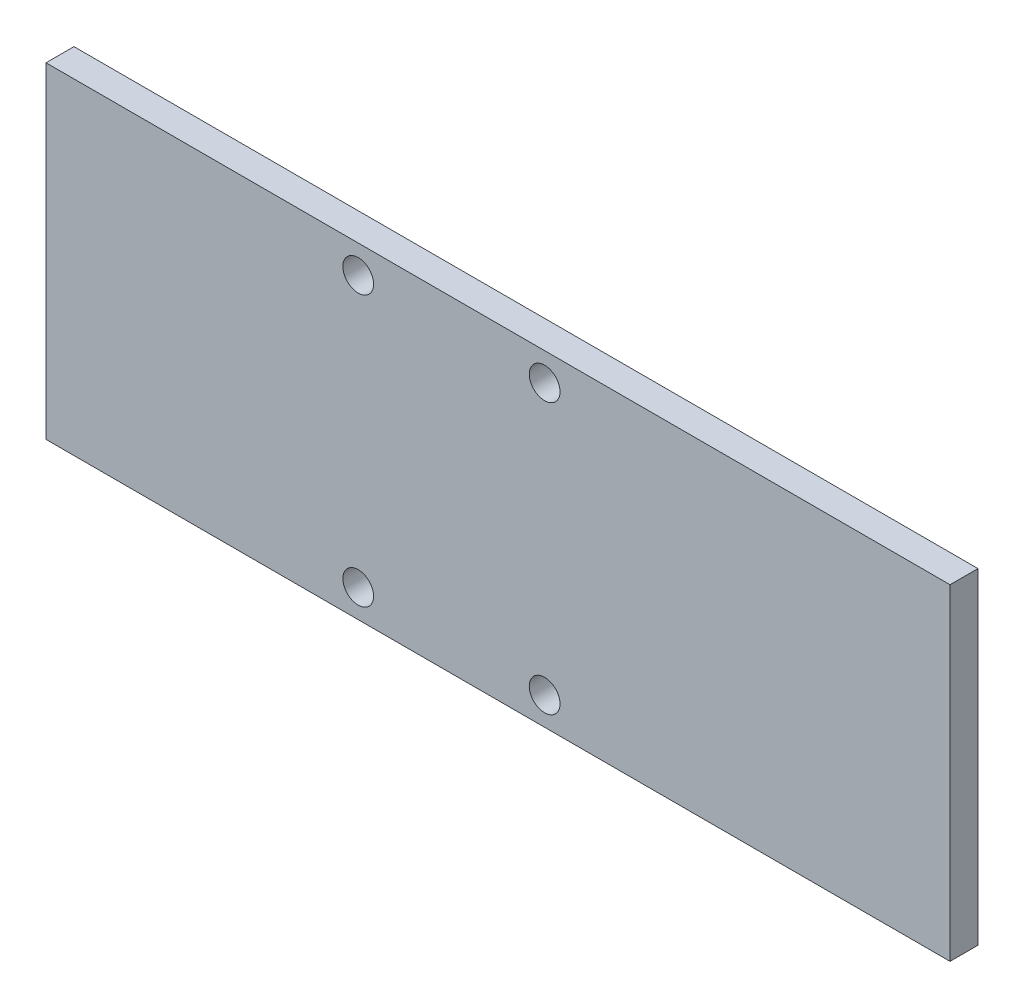
ISO-10303-21;
HEADER;
FILE_DESCRIPTION(('STEP AP214'),'2;1');
FILE_NAME('part.step','',(''),(''),'','','');
FILE_SCHEMA(('AUTOMOTIVE_DESIGN { 1 0 10303 214 1 1 1 1 }'));
ENDSEC;
DATA;
#1=APPLICATION_CONTEXT('core data for automotive mechanical design processes');
#2=APPLICATION_PROTOCOL_DEFINITION('international standard','automotive_design',2000,#1);
#3=PRODUCT_CONTEXT('',#1,'mechanical');
#4=PRODUCT('Part','Part','',(#3));
#5=PRODUCT_RELATED_PRODUCT_CATEGORY('part','',(#4));
#6=PRODUCT_DEFINITION_FORMATION('','',#4);
#7=PRODUCT_DEFINITION_CONTEXT('part definition',#1,'design');
#8=PRODUCT_DEFINITION('design','',#6,#7);
#9=PRODUCT_DEFINITION_SHAPE('','',#8);
#10=(LENGTH_UNIT() NAMED_UNIT(*) SI_UNIT(.MILLI.,.METRE.));
#11=(NAMED_UNIT(*) PLANE_ANGLE_UNIT() SI_UNIT($,.RADIAN.));
#12=(NAMED_UNIT(*) SI_UNIT($,.STERADIAN.) SOLID_ANGLE_UNIT());
#13=UNCERTAINTY_MEASURE_WITH_UNIT(LENGTH_MEASURE(1.E-05),#10,'distance_accuracy_value','');
#14=(GEOMETRIC_REPRESENTATION_CONTEXT(3) GLOBAL_UNCERTAINTY_ASSIGNED_CONTEXT((#13)) GLOBAL_UNIT_ASSIGNED_CONTEXT((#10,
#11,#12)) REPRESENTATION_CONTEXT('',''));
#15=CARTESIAN_POINT('',(0.,0.,0.));
#16=DIRECTION('',(0.,0.,1.));
#17=DIRECTION('',(1.,0.,0.));
#18=AXIS2_PLACEMENT_3D('',#15,#16,#17);
#19=CARTESIAN_POINT('',(48.5,-17.5,3.));
#20=DIRECTION('',(-1.,0.,0.));
#21=DIRECTION('',(0.,-1.,0.));
#22=AXIS2_PLACEMENT_3D('',#19,#20,#21);
#23=PLANE('',#22);
#24=DIRECTION('',(0.,1.,0.));
#25=VECTOR('',#24,1.);
#26=CARTESIAN_POINT('',(48.5,-17.5,0.));
#27=LINE('',#26,#25);
#28=CARTESIAN_POINT('',(48.5,-17.5,0.));
#29=VERTEX_POINT('',#28);
#30=CARTESIAN_POINT('',(48.5,17.5,0.));
#31=VERTEX_POINT('',#30);
#32=EDGE_CURVE('E104',#29,#31,#27,.T.);
#33=ORIENTED_EDGE('',*,*,#32,.T.);
#34=DIRECTION('',(0.,0.,-1.));
#35=VECTOR('',#34,1.);
#36=CARTESIAN_POINT('',(48.5,17.5,3.));
#37=LINE('',#36,#35);
#38=CARTESIAN_POINT('',(48.5,17.5,3.));
#39=VERTEX_POINT('',#38);
#40=EDGE_CURVE('E11',#39,#31,#37,.T.);
#41=ORIENTED_EDGE('',*,*,#40,.F.);
#42=DIRECTION('',(0.,1.,0.));
#43=VECTOR('',#42,1.);
#44=CARTESIAN_POINT('',(48.5,-17.5,3.));
#45=LINE('',#44,#43);
#46=CARTESIAN_POINT('',(48.5,-17.5,3.));
#47=VERTEX_POINT('',#46);
#48=EDGE_CURVE('E92',#47,#39,#45,.T.);
#49=ORIENTED_EDGE('',*,*,#48,.F.);
#50=DIRECTION('',(0.,0.,-1.));
#51=VECTOR('',#50,1.);
#52=CARTESIAN_POINT('',(48.5,-17.5,3.));
#53=LINE('',#52,#51);
#54=EDGE_CURVE('E100',#47,#29,#53,.T.);
#55=ORIENTED_EDGE('',*,*,#54,.T.);
#56=EDGE_LOOP('',(#33,#41,#49,#55));
#57=FACE_BOUND('',#56,.T.);
#58=ADVANCED_FACE('F41',(#57),#23,.F.);
#59=CARTESIAN_POINT('',(-48.5,17.5,3.));
#60=DIRECTION('',(0.,-1.,0.));
#61=DIRECTION('',(1.,0.,0.));
#62=AXIS2_PLACEMENT_3D('',#59,#60,#61);
#63=PLANE('',#62);
#64=DIRECTION('',(-1.,0.,0.));
#65=VECTOR('',#64,1.);
#66=CARTESIAN_POINT('',(-48.5,17.5,0.));
#67=LINE('',#66,#65);
#68=CARTESIAN_POINT('',(-48.5,17.5,0.));
#69=VERTEX_POINT('',#68);
#70=EDGE_CURVE('E96',#31,#69,#67,.T.);
#71=ORIENTED_EDGE('',*,*,#70,.T.);
#72=DIRECTION('',(0.,0.,-1.));
#73=VECTOR('',#72,1.);
#74=CARTESIAN_POINT('',(-48.5,17.5,3.));
#75=LINE('',#74,#73);
#76=CARTESIAN_POINT('',(-48.5,17.5,3.));
#77=VERTEX_POINT('',#76);
#78=EDGE_CURVE('E49',#77,#69,#75,.T.);
#79=ORIENTED_EDGE('',*,*,#78,.F.);
#80=DIRECTION('',(-1.,0.,0.));
#81=VECTOR('',#80,1.);
#82=CARTESIAN_POINT('',(-48.5,17.5,3.));
#83=LINE('',#82,#81);
#84=EDGE_CURVE('E87',#39,#77,#83,.T.);
#85=ORIENTED_EDGE('',*,*,#84,.F.);
#86=ORIENTED_EDGE('',*,*,#40,.T.);
#87=EDGE_LOOP('',(#71,#79,#85,#86));
#88=FACE_BOUND('',#87,.T.);
#89=ADVANCED_FACE('F95',(#88),#63,.F.);
#90=CARTESIAN_POINT('',(-48.5,-17.5,3.));
#91=DIRECTION('',(1.,0.,0.));
#92=DIRECTION('',(0.,0.,-1.));
#93=AXIS2_PLACEMENT_3D('',#90,#91,#92);
#94=PLANE('',#93);
#95=DIRECTION('',(0.,-1.,0.));
#96=VECTOR('',#95,1.);
#97=CARTESIAN_POINT('',(-48.5,-17.5,0.));
#98=LINE('',#97,#96);
#99=CARTESIAN_POINT('',(-48.5,-17.5,0.));
#100=VERTEX_POINT('',#99);
#101=EDGE_CURVE('E74',#69,#100,#98,.T.);
#102=ORIENTED_EDGE('',*,*,#101,.T.);
#103=DIRECTION('',(0.,0.,-1.));
#104=VECTOR('',#103,1.);
#105=CARTESIAN_POINT('',(-48.5,-17.5,3.));
#106=LINE('',#105,#104);
#107=CARTESIAN_POINT('',(-48.5,-17.5,3.));
#108=VERTEX_POINT('',#107);
#109=EDGE_CURVE('E97',#108,#100,#106,.T.);
#110=ORIENTED_EDGE('',*,*,#109,.F.);
#111=DIRECTION('',(0.,-1.,0.));
#112=VECTOR('',#111,1.);
#113=CARTESIAN_POINT('',(-48.5,-17.5,3.));
#114=LINE('',#113,#112);
#115=EDGE_CURVE('E90',#77,#108,#114,.T.);
#116=ORIENTED_EDGE('',*,*,#115,.F.);
#117=ORIENTED_EDGE('',*,*,#78,.T.);
#118=EDGE_LOOP('',(#102,#110,#116,#117));
#119=FACE_BOUND('',#118,.T.);
#120=ADVANCED_FACE('F98',(#119),#94,.F.);
#121=CARTESIAN_POINT('',(-48.5,-17.5,3.));
#122=DIRECTION('',(0.,1.,0.));
#123=DIRECTION('',(-1.,0.,0.));
#124=AXIS2_PLACEMENT_3D('',#121,#122,#123);
#125=PLANE('',#124);
#126=DIRECTION('',(1.,0.,0.));
#127=VECTOR('',#126,1.);
#128=CARTESIAN_POINT('',(-48.5,-17.5,0.));
#129=LINE('',#128,#127);
#130=EDGE_CURVE('E80',#100,#29,#129,.T.);
#131=ORIENTED_EDGE('',*,*,#130,.T.);
#132=ORIENTED_EDGE('',*,*,#54,.F.);
#133=DIRECTION('',(1.,0.,0.));
#134=VECTOR('',#133,1.);
#135=CARTESIAN_POINT('',(-48.5,-17.5,3.));
#136=LINE('',#135,#134);
#137=EDGE_CURVE('E57',#108,#47,#136,.T.);
#138=ORIENTED_EDGE('',*,*,#137,.F.);
#139=ORIENTED_EDGE('',*,*,#109,.T.);
#140=EDGE_LOOP('',(#131,#132,#138,#139));
#141=FACE_BOUND('',#140,.T.);
#142=ADVANCED_FACE('F112',(#141),#125,.F.);
#143=CARTESIAN_POINT('',(0.,0.,3.));
#144=DIRECTION('',(0.,0.,-1.));
#145=DIRECTION('',(-1.,0.,0.));
#146=AXIS2_PLACEMENT_3D('',#143,#144,#145);
#147=PLANE('',#146);
#148=CARTESIAN_POINT('',(-15.,-14.5,3.));
#149=DIRECTION('',(0.,0.,-1.));
#150=DIRECTION('',(-1.,0.,0.));
#151=AXIS2_PLACEMENT_3D('',#148,#149,#150);
#152=CIRCLE('',#151,1.65);
#153=CARTESIAN_POINT('',(-16.6499999999999,-14.5,3.));
#154=VERTEX_POINT('',#153);
#155=EDGE_CURVE('E131',#154,#154,#152,.T.);
#156=ORIENTED_EDGE('',*,*,#155,.T.);
#157=EDGE_LOOP('',(#156));
#158=FACE_BOUND('',#157,.T.);
#159=CARTESIAN_POINT('',(5.00000000000005,14.5,3.));
#160=DIRECTION('',(0.,0.,-1.));
#161=DIRECTION('',(-1.,0.,0.));
#162=AXIS2_PLACEMENT_3D('',#159,#160,#161);
#163=CIRCLE('',#162,1.65);
#164=CARTESIAN_POINT('',(3.35000000000005,14.5,3.));
#165=VERTEX_POINT('',#164);
#166=EDGE_CURVE('E124',#165,#165,#163,.T.);
#167=ORIENTED_EDGE('',*,*,#166,.T.);
#168=EDGE_LOOP('',(#167));
#169=FACE_BOUND('',#168,.T.);
#170=CARTESIAN_POINT('',(-15.,14.5,3.));
#171=DIRECTION('',(0.,0.,-1.));
#172=DIRECTION('',(-1.,0.,0.));
#173=AXIS2_PLACEMENT_3D('',#170,#171,#172);
#174=CIRCLE('',#173,1.65);
#175=CARTESIAN_POINT('',(-16.65,14.5,3.));
#176=VERTEX_POINT('',#175);
#177=EDGE_CURVE('E136',#176,#176,#174,.T.);
#178=ORIENTED_EDGE('',*,*,#177,.T.);
#179=EDGE_LOOP('',(#178));
#180=FACE_BOUND('',#179,.T.);
#181=CARTESIAN_POINT('',(5.00000000000005,-14.5,3.));
#182=DIRECTION('',(0.,0.,-1.));
#183=DIRECTION('',(-1.,0.,0.));
#184=AXIS2_PLACEMENT_3D('',#181,#182,#183);
#185=CIRCLE('',#184,1.65);
#186=CARTESIAN_POINT('',(3.35000000000005,-14.5,3.));
#187=VERTEX_POINT('',#186);
#188=EDGE_CURVE('E107',#187,#187,#185,.T.);
#189=ORIENTED_EDGE('',*,*,#188,.T.);
#190=EDGE_LOOP('',(#189));
#191=FACE_BOUND('',#190,.T.);
#192=ORIENTED_EDGE('',*,*,#48,.T.);
#193=ORIENTED_EDGE('',*,*,#84,.T.);
#194=ORIENTED_EDGE('',*,*,#115,.T.);
#195=ORIENTED_EDGE('',*,*,#137,.T.);
#196=EDGE_LOOP('',(#192,#193,#194,#195));
#197=FACE_BOUND('',#196,.T.);
#198=ADVANCED_FACE('F88',(#158,#169,#180,#191,#197),#147,.F.);
#199=CARTESIAN_POINT('',(0.,0.,0.));
#200=DIRECTION('',(0.,0.,-1.));
#201=DIRECTION('',(-1.,0.,0.));
#202=AXIS2_PLACEMENT_3D('',#199,#200,#201);
#203=PLANE('',#202);
#204=CARTESIAN_POINT('',(-15.,-14.5,0.));
#205=DIRECTION('',(0.,0.,-1.));
#206=DIRECTION('',(-1.,0.,0.));
#207=AXIS2_PLACEMENT_3D('',#204,#205,#206);
#208=CIRCLE('',#207,1.65);
#209=CARTESIAN_POINT('',(-16.6499999999999,-14.5,0.));
#210=VERTEX_POINT('',#209);
#211=EDGE_CURVE('E121',#210,#210,#208,.T.);
#212=ORIENTED_EDGE('',*,*,#211,.F.);
#213=EDGE_LOOP('',(#212));
#214=FACE_BOUND('',#213,.T.);
#215=CARTESIAN_POINT('',(5.00000000000005,14.5,0.));
#216=DIRECTION('',(0.,0.,-1.));
#217=DIRECTION('',(-1.,0.,0.));
#218=AXIS2_PLACEMENT_3D('',#215,#216,#217);
#219=CIRCLE('',#218,1.65);
#220=CARTESIAN_POINT('',(3.35000000000005,14.5,0.));
#221=VERTEX_POINT('',#220);
#222=EDGE_CURVE('E127',#221,#221,#219,.T.);
#223=ORIENTED_EDGE('',*,*,#222,.F.);
#224=EDGE_LOOP('',(#223));
#225=FACE_BOUND('',#224,.T.);
#226=CARTESIAN_POINT('',(-15.,14.5,0.));
#227=DIRECTION('',(0.,0.,-1.));
#228=DIRECTION('',(-1.,0.,0.));
#229=AXIS2_PLACEMENT_3D('',#226,#227,#228);
#230=CIRCLE('',#229,1.65);
#231=CARTESIAN_POINT('',(-16.65,14.5,0.));
#232=VERTEX_POINT('',#231);
#233=EDGE_CURVE('E128',#232,#232,#230,.T.);
#234=ORIENTED_EDGE('',*,*,#233,.F.);
#235=EDGE_LOOP('',(#234));
#236=FACE_BOUND('',#235,.T.);
#237=CARTESIAN_POINT('',(5.00000000000005,-14.5,0.));
#238=DIRECTION('',(0.,0.,-1.));
#239=DIRECTION('',(-1.,0.,0.));
#240=AXIS2_PLACEMENT_3D('',#237,#238,#239);
#241=CIRCLE('',#240,1.65);
#242=CARTESIAN_POINT('',(3.35000000000005,-14.5,0.));
#243=VERTEX_POINT('',#242);
#244=EDGE_CURVE('E118',#243,#243,#241,.T.);
#245=ORIENTED_EDGE('',*,*,#244,.F.);
#246=EDGE_LOOP('',(#245));
#247=FACE_BOUND('',#246,.T.);
#248=ORIENTED_EDGE('',*,*,#32,.F.);
#249=ORIENTED_EDGE('',*,*,#130,.F.);
#250=ORIENTED_EDGE('',*,*,#101,.F.);
#251=ORIENTED_EDGE('',*,*,#70,.F.);
#252=EDGE_LOOP('',(#248,#249,#250,#251));
#253=FACE_BOUND('',#252,.T.);
#254=ADVANCED_FACE('F115',(#214,#225,#236,#247,#253),#203,.T.);
#255=CARTESIAN_POINT('',(5.00000000000005,-14.5,3.));
#256=DIRECTION('',(0.,0.,-1.));
#257=DIRECTION('',(-1.,0.,0.));
#258=AXIS2_PLACEMENT_3D('',#255,#256,#257);
#259=CYLINDRICAL_SURFACE('',#258,1.65);
#260=ORIENTED_EDGE('',*,*,#188,.F.);
#261=EDGE_LOOP('',(#260));
#262=FACE_BOUND('',#261,.T.);
#263=ORIENTED_EDGE('',*,*,#244,.T.);
#264=EDGE_LOOP('',(#263));
#265=FACE_BOUND('',#264,.T.);
#266=ADVANCED_FACE('F146',(#262,#265),#259,.F.);
#267=CARTESIAN_POINT('',(-15.,14.5,3.));
#268=DIRECTION('',(0.,0.,-1.));
#269=DIRECTION('',(-1.,0.,0.));
#270=AXIS2_PLACEMENT_3D('',#267,#268,#269);
#271=CYLINDRICAL_SURFACE('',#270,1.65);
#272=ORIENTED_EDGE('',*,*,#177,.F.);
#273=EDGE_LOOP('',(#272));
#274=FACE_BOUND('',#273,.T.);
#275=ORIENTED_EDGE('',*,*,#233,.T.);
#276=EDGE_LOOP('',(#275));
#277=FACE_BOUND('',#276,.T.);
#278=ADVANCED_FACE('F142',(#274,#277),#271,.F.);
#279=CARTESIAN_POINT('',(5.00000000000005,14.5,3.));
#280=DIRECTION('',(0.,0.,-1.));
#281=DIRECTION('',(-1.,0.,0.));
#282=AXIS2_PLACEMENT_3D('',#279,#280,#281);
#283=CYLINDRICAL_SURFACE('',#282,1.65);
#284=ORIENTED_EDGE('',*,*,#166,.F.);
#285=EDGE_LOOP('',(#284));
#286=FACE_BOUND('',#285,.T.);
#287=ORIENTED_EDGE('',*,*,#222,.T.);
#288=EDGE_LOOP('',(#287));
#289=FACE_BOUND('',#288,.T.);
#290=ADVANCED_FACE('F157',(#286,#289),#283,.F.);
#291=CARTESIAN_POINT('',(-15.,-14.5,3.));
#292=DIRECTION('',(0.,0.,-1.));
#293=DIRECTION('',(-1.,0.,0.));
#294=AXIS2_PLACEMENT_3D('',#291,#292,#293);
#295=CYLINDRICAL_SURFACE('',#294,1.65);
#296=ORIENTED_EDGE('',*,*,#155,.F.);
#297=EDGE_LOOP('',(#296));
#298=FACE_BOUND('',#297,.T.);
#299=ORIENTED_EDGE('',*,*,#211,.T.);
#300=EDGE_LOOP('',(#299));
#301=FACE_BOUND('',#300,.T.);
#302=ADVANCED_FACE('F186',(#298,#301),#295,.F.);
#303=CLOSED_SHELL('',(#58,#89,#120,#142,#198,#254,#266,#278,#290,#302));
#304=MANIFOLD_SOLID_BREP('B2',#303);
#305=ADVANCED_BREP_SHAPE_REPRESENTATION('',(#18,#304),#14);
#306=SHAPE_DEFINITION_REPRESENTATION(#9,#305);
ENDSEC;
END-ISO-10303-21;
